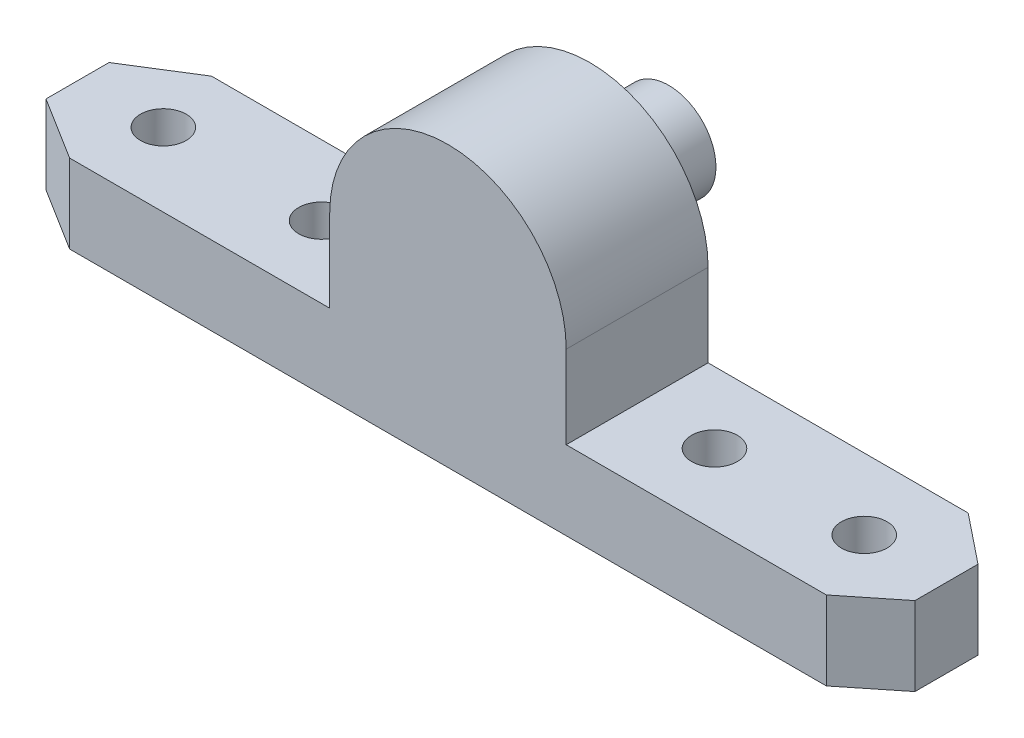
ISO-10303-21;
HEADER;
FILE_DESCRIPTION(('STEP AP214'),'2;1');
FILE_NAME('part.step','',(''),(''),'','','');
FILE_SCHEMA(('AUTOMOTIVE_DESIGN { 1 0 10303 214 1 1 1 1 }'));
ENDSEC;
DATA;
#1=APPLICATION_CONTEXT('core data for automotive mechanical design processes');
#2=APPLICATION_PROTOCOL_DEFINITION('international standard','automotive_design',2000,#1);
#3=PRODUCT_CONTEXT('',#1,'mechanical');
#4=PRODUCT('Part','Part','',(#3));
#5=PRODUCT_RELATED_PRODUCT_CATEGORY('part','',(#4));
#6=PRODUCT_DEFINITION_FORMATION('','',#4);
#7=PRODUCT_DEFINITION_CONTEXT('part definition',#1,'design');
#8=PRODUCT_DEFINITION('design','',#6,#7);
#9=PRODUCT_DEFINITION_SHAPE('','',#8);
#10=(LENGTH_UNIT() NAMED_UNIT(*) SI_UNIT(.MILLI.,.METRE.));
#11=(NAMED_UNIT(*) PLANE_ANGLE_UNIT() SI_UNIT($,.RADIAN.));
#12=(NAMED_UNIT(*) SI_UNIT($,.STERADIAN.) SOLID_ANGLE_UNIT());
#13=UNCERTAINTY_MEASURE_WITH_UNIT(LENGTH_MEASURE(1.E-05),#10,'distance_accuracy_value','');
#14=(GEOMETRIC_REPRESENTATION_CONTEXT(3) GLOBAL_UNCERTAINTY_ASSIGNED_CONTEXT((#13)) GLOBAL_UNIT_ASSIGNED_CONTEXT((#10,
#11,#12)) REPRESENTATION_CONTEXT('',''));
#15=CARTESIAN_POINT('',(0.,0.,0.));
#16=DIRECTION('',(0.,0.,1.));
#17=DIRECTION('',(1.,0.,0.));
#18=AXIS2_PLACEMENT_3D('',#15,#16,#17);
#19=CARTESIAN_POINT('',(0.,5.,0.));
#20=DIRECTION('',(0.,-1.,0.));
#21=DIRECTION('',(0.,0.,-1.));
#22=AXIS2_PLACEMENT_3D('',#19,#20,#21);
#23=PLANE('',#22);
#24=CARTESIAN_POINT('',(-22.7160462296342,5.,-0.159099942734997));
#25=DIRECTION('',(0.,1.,0.));
#26=DIRECTION('',(0.,0.,1.));
#27=AXIS2_PLACEMENT_3D('',#24,#25,#26);
#28=CIRCLE('',#27,1.45);
#29=CARTESIAN_POINT('',(-22.7160462296342,5.,1.290900057265));
#30=VERTEX_POINT('',#29);
#31=EDGE_CURVE('E283',#30,#30,#28,.T.);
#32=ORIENTED_EDGE('',*,*,#31,.F.);
#33=EDGE_LOOP('',(#32));
#34=FACE_BOUND('',#33,.T.);
#35=CARTESIAN_POINT('',(-12.5720154098781,5.,-0.0530333142449984));
#36=DIRECTION('',(0.,1.,0.));
#37=DIRECTION('',(0.,0.,1.));
#38=AXIS2_PLACEMENT_3D('',#35,#36,#37);
#39=CIRCLE('',#38,1.45);
#40=CARTESIAN_POINT('',(-12.5720154098781,5.,1.396966685755));
#41=VERTEX_POINT('',#40);
#42=EDGE_CURVE('E287',#41,#41,#39,.T.);
#43=ORIENTED_EDGE('',*,*,#42,.F.);
#44=EDGE_LOOP('',(#43));
#45=FACE_BOUND('',#44,.T.);
#46=DIRECTION('',(0.,0.,1.));
#47=VECTOR('',#46,1.);
#48=CARTESIAN_POINT('',(-7.49999999999999,5.,-4.5));
#49=LINE('',#48,#47);
#50=CARTESIAN_POINT('',(-7.49999999999999,5.,-4.5));
#51=VERTEX_POINT('',#50);
#52=CARTESIAN_POINT('',(-7.49999999999999,5.,4.5));
#53=VERTEX_POINT('',#52);
#54=EDGE_CURVE('E241',#51,#53,#49,.T.);
#55=ORIENTED_EDGE('',*,*,#54,.F.);
#56=DIRECTION('',(-1.,0.,0.));
#57=VECTOR('',#56,1.);
#58=CARTESIAN_POINT('',(-24.,5.,-4.5));
#59=LINE('',#58,#57);
#60=CARTESIAN_POINT('',(-24.,5.,-4.5));
#61=VERTEX_POINT('',#60);
#62=EDGE_CURVE('E114',#51,#61,#59,.T.);
#63=ORIENTED_EDGE('',*,*,#62,.T.);
#64=DIRECTION('',(-0.847998304005088,0.,0.52999894000318));
#65=VECTOR('',#64,1.);
#66=CARTESIAN_POINT('',(-24.,5.,-4.5));
#67=LINE('',#66,#65);
#68=CARTESIAN_POINT('',(-28.,5.,-1.99999999999999));
#69=VERTEX_POINT('',#68);
#70=EDGE_CURVE('E255',#61,#69,#67,.T.);
#71=ORIENTED_EDGE('',*,*,#70,.T.);
#72=DIRECTION('',(0.,0.,1.));
#73=VECTOR('',#72,1.);
#74=CARTESIAN_POINT('',(-28.,5.,-1.99999999999999));
#75=LINE('',#74,#73);
#76=CARTESIAN_POINT('',(-28.,5.,2.));
#77=VERTEX_POINT('',#76);
#78=EDGE_CURVE('E258',#69,#77,#75,.T.);
#79=ORIENTED_EDGE('',*,*,#78,.T.);
#80=DIRECTION('',(0.847998304005088,0.,0.529998940003179));
#81=VECTOR('',#80,1.);
#82=CARTESIAN_POINT('',(-28.,5.,2.));
#83=LINE('',#82,#81);
#84=CARTESIAN_POINT('',(-24.,5.,4.5));
#85=VERTEX_POINT('',#84);
#86=EDGE_CURVE('E261',#77,#85,#83,.T.);
#87=ORIENTED_EDGE('',*,*,#86,.T.);
#88=DIRECTION('',(1.,0.,0.));
#89=VECTOR('',#88,1.);
#90=CARTESIAN_POINT('',(-24.,5.,4.5));
#91=LINE('',#90,#89);
#92=EDGE_CURVE('E143',#85,#53,#91,.T.);
#93=ORIENTED_EDGE('',*,*,#92,.T.);
#94=EDGE_LOOP('',(#55,#63,#71,#79,#87,#93));
#95=FACE_BOUND('',#94,.T.);
#96=ADVANCED_FACE('F45',(#34,#45,#95),#23,.F.);
#97=CARTESIAN_POINT('',(-24.,5.,-4.5));
#98=DIRECTION('',(0.,0.,1.));
#99=DIRECTION('',(1.,0.,0.));
#100=AXIS2_PLACEMENT_3D('',#97,#98,#99);
#101=PLANE('',#100);
#102=CARTESIAN_POINT('',(0.,11.,-4.5));
#103=DIRECTION('',(0.,0.,1.));
#104=DIRECTION('',(1.,0.,0.));
#105=AXIS2_PLACEMENT_3D('',#102,#103,#104);
#106=CIRCLE('',#105,3.);
#107=CARTESIAN_POINT('',(3.,11.,-4.5));
#108=VERTEX_POINT('',#107);
#109=EDGE_CURVE('E288',#108,#108,#106,.T.);
#110=ORIENTED_EDGE('',*,*,#109,.T.);
#111=EDGE_LOOP('',(#110));
#112=FACE_BOUND('',#111,.T.);
#113=DIRECTION('',(-1.,0.,0.));
#114=VECTOR('',#113,1.);
#115=CARTESIAN_POINT('',(-24.,0.,-4.5));
#116=LINE('',#115,#114);
#117=CARTESIAN_POINT('',(24.,0.,-4.5));
#118=VERTEX_POINT('',#117);
#119=CARTESIAN_POINT('',(-24.,0.,-4.5));
#120=VERTEX_POINT('',#119);
#121=EDGE_CURVE('E164',#118,#120,#116,.T.);
#122=ORIENTED_EDGE('',*,*,#121,.T.);
#123=DIRECTION('',(0.,-1.,0.));
#124=VECTOR('',#123,1.);
#125=CARTESIAN_POINT('',(-24.,5.,-4.5));
#126=LINE('',#125,#124);
#127=EDGE_CURVE('E11',#61,#120,#126,.T.);
#128=ORIENTED_EDGE('',*,*,#127,.F.);
#129=ORIENTED_EDGE('',*,*,#62,.F.);
#130=DIRECTION('',(0.,-1.,0.));
#131=VECTOR('',#130,1.);
#132=CARTESIAN_POINT('',(-7.49999999999999,5.,-4.5));
#133=LINE('',#132,#131);
#134=CARTESIAN_POINT('',(-7.49999999999999,10.25,-4.5));
#135=VERTEX_POINT('',#134);
#136=EDGE_CURVE('E232',#135,#51,#133,.T.);
#137=ORIENTED_EDGE('',*,*,#136,.F.);
#138=CARTESIAN_POINT('',(0.,10.25,-4.5));
#139=DIRECTION('',(0.,0.,1.));
#140=DIRECTION('',(-1.,0.,0.));
#141=AXIS2_PLACEMENT_3D('',#138,#139,#140);
#142=CIRCLE('',#141,7.5);
#143=CARTESIAN_POINT('',(7.50000000000001,10.25,-4.5));
#144=VERTEX_POINT('',#143);
#145=EDGE_CURVE('E271',#144,#135,#142,.T.);
#146=ORIENTED_EDGE('',*,*,#145,.F.);
#147=DIRECTION('',(0.,1.,0.));
#148=VECTOR('',#147,1.);
#149=CARTESIAN_POINT('',(7.50000000000001,10.25,-4.5));
#150=LINE('',#149,#148);
#151=CARTESIAN_POINT('',(7.50000000000001,5.,-4.5));
#152=VERTEX_POINT('',#151);
#153=EDGE_CURVE('E238',#152,#144,#150,.T.);
#154=ORIENTED_EDGE('',*,*,#153,.F.);
#155=CARTESIAN_POINT('',(24.,5.,-4.5));
#156=VERTEX_POINT('',#155);
#157=EDGE_CURVE('E252',#156,#152,#59,.T.);
#158=ORIENTED_EDGE('',*,*,#157,.F.);
#159=DIRECTION('',(0.,-1.,0.));
#160=VECTOR('',#159,1.);
#161=CARTESIAN_POINT('',(24.,5.,-4.5));
#162=LINE('',#161,#160);
#163=EDGE_CURVE('E160',#156,#118,#162,.T.);
#164=ORIENTED_EDGE('',*,*,#163,.T.);
#165=EDGE_LOOP('',(#122,#128,#129,#137,#146,#154,#158,#164));
#166=FACE_BOUND('',#165,.T.);
#167=ADVANCED_FACE('F47',(#112,#166),#101,.F.);
#168=CARTESIAN_POINT('',(-24.,5.,-4.5));
#169=DIRECTION('',(0.52999894000318,0.,0.847998304005088));
#170=DIRECTION('',(0.847998304005088,0.,-0.52999894000318));
#171=AXIS2_PLACEMENT_3D('',#168,#169,#170);
#172=PLANE('',#171);
#173=DIRECTION('',(-0.847998304005088,0.,0.52999894000318));
#174=VECTOR('',#173,1.);
#175=CARTESIAN_POINT('',(-24.,0.,-4.5));
#176=LINE('',#175,#174);
#177=CARTESIAN_POINT('',(-28.,0.,-1.99999999999999));
#178=VERTEX_POINT('',#177);
#179=EDGE_CURVE('E168',#120,#178,#176,.T.);
#180=ORIENTED_EDGE('',*,*,#179,.T.);
#181=DIRECTION('',(0.,-1.,0.));
#182=VECTOR('',#181,1.);
#183=CARTESIAN_POINT('',(-28.,5.,-1.99999999999999));
#184=LINE('',#183,#182);
#185=EDGE_CURVE('E55',#69,#178,#184,.T.);
#186=ORIENTED_EDGE('',*,*,#185,.F.);
#187=ORIENTED_EDGE('',*,*,#70,.F.);
#188=ORIENTED_EDGE('',*,*,#127,.T.);
#189=EDGE_LOOP('',(#180,#186,#187,#188));
#190=FACE_BOUND('',#189,.T.);
#191=ADVANCED_FACE('F322',(#190),#172,.F.);
#192=CARTESIAN_POINT('',(-28.,5.,-1.99999999999999));
#193=DIRECTION('',(1.,0.,0.));
#194=DIRECTION('',(0.,0.,-1.));
#195=AXIS2_PLACEMENT_3D('',#192,#193,#194);
#196=PLANE('',#195);
#197=DIRECTION('',(0.,0.,1.));
#198=VECTOR('',#197,1.);
#199=CARTESIAN_POINT('',(-28.,0.,-1.99999999999999));
#200=LINE('',#199,#198);
#201=CARTESIAN_POINT('',(-28.,0.,2.));
#202=VERTEX_POINT('',#201);
#203=EDGE_CURVE('E172',#178,#202,#200,.T.);
#204=ORIENTED_EDGE('',*,*,#203,.T.);
#205=DIRECTION('',(0.,-1.,0.));
#206=VECTOR('',#205,1.);
#207=CARTESIAN_POINT('',(-28.,5.,2.));
#208=LINE('',#207,#206);
#209=EDGE_CURVE('E198',#77,#202,#208,.T.);
#210=ORIENTED_EDGE('',*,*,#209,.F.);
#211=ORIENTED_EDGE('',*,*,#78,.F.);
#212=ORIENTED_EDGE('',*,*,#185,.T.);
#213=EDGE_LOOP('',(#204,#210,#211,#212));
#214=FACE_BOUND('',#213,.T.);
#215=ADVANCED_FACE('F477',(#214),#196,.F.);
#216=CARTESIAN_POINT('',(-28.,5.,2.));
#217=DIRECTION('',(0.529998940003179,0.,-0.847998304005088));
#218=DIRECTION('',(-0.847998304005088,0.,-0.529998940003179));
#219=AXIS2_PLACEMENT_3D('',#216,#217,#218);
#220=PLANE('',#219);
#221=DIRECTION('',(0.847998304005088,0.,0.529998940003179));
#222=VECTOR('',#221,1.);
#223=CARTESIAN_POINT('',(-28.,0.,2.));
#224=LINE('',#223,#222);
#225=CARTESIAN_POINT('',(-24.,0.,4.5));
#226=VERTEX_POINT('',#225);
#227=EDGE_CURVE('E175',#202,#226,#224,.T.);
#228=ORIENTED_EDGE('',*,*,#227,.T.);
#229=DIRECTION('',(0.,-1.,0.));
#230=VECTOR('',#229,1.);
#231=CARTESIAN_POINT('',(-24.,5.,4.5));
#232=LINE('',#231,#230);
#233=EDGE_CURVE('E194',#85,#226,#232,.T.);
#234=ORIENTED_EDGE('',*,*,#233,.F.);
#235=ORIENTED_EDGE('',*,*,#86,.F.);
#236=ORIENTED_EDGE('',*,*,#209,.T.);
#237=EDGE_LOOP('',(#228,#234,#235,#236));
#238=FACE_BOUND('',#237,.T.);
#239=ADVANCED_FACE('F420',(#238),#220,.F.);
#240=CARTESIAN_POINT('',(-24.,5.,4.5));
#241=DIRECTION('',(0.,0.,-1.));
#242=DIRECTION('',(-1.,0.,0.));
#243=AXIS2_PLACEMENT_3D('',#240,#241,#242);
#244=PLANE('',#243);
#245=DIRECTION('',(1.,0.,0.));
#246=VECTOR('',#245,1.);
#247=CARTESIAN_POINT('',(-24.,0.,4.5));
#248=LINE('',#247,#246);
#249=CARTESIAN_POINT('',(24.,0.,4.5));
#250=VERTEX_POINT('',#249);
#251=EDGE_CURVE('E178',#226,#250,#248,.T.);
#252=ORIENTED_EDGE('',*,*,#251,.T.);
#253=DIRECTION('',(0.,-1.,0.));
#254=VECTOR('',#253,1.);
#255=CARTESIAN_POINT('',(24.,5.,4.5));
#256=LINE('',#255,#254);
#257=CARTESIAN_POINT('',(24.,5.,4.5));
#258=VERTEX_POINT('',#257);
#259=EDGE_CURVE('E153',#258,#250,#256,.T.);
#260=ORIENTED_EDGE('',*,*,#259,.F.);
#261=CARTESIAN_POINT('',(7.50000000000001,5.,4.5));
#262=VERTEX_POINT('',#261);
#263=EDGE_CURVE('E138',#262,#258,#91,.T.);
#264=ORIENTED_EDGE('',*,*,#263,.F.);
#265=DIRECTION('',(0.,1.,0.));
#266=VECTOR('',#265,1.);
#267=CARTESIAN_POINT('',(7.50000000000001,10.25,4.5));
#268=LINE('',#267,#266);
#269=CARTESIAN_POINT('',(7.50000000000001,10.25,4.5));
#270=VERTEX_POINT('',#269);
#271=EDGE_CURVE('E63',#262,#270,#268,.T.);
#272=ORIENTED_EDGE('',*,*,#271,.T.);
#273=CARTESIAN_POINT('',(0.,10.25,4.5));
#274=DIRECTION('',(0.,0.,1.));
#275=DIRECTION('',(-1.,0.,0.));
#276=AXIS2_PLACEMENT_3D('',#273,#274,#275);
#277=CIRCLE('',#276,7.5);
#278=CARTESIAN_POINT('',(-7.49999999999999,10.25,4.5));
#279=VERTEX_POINT('',#278);
#280=EDGE_CURVE('E223',#270,#279,#277,.T.);
#281=ORIENTED_EDGE('',*,*,#280,.T.);
#282=DIRECTION('',(0.,-1.,0.));
#283=VECTOR('',#282,1.);
#284=CARTESIAN_POINT('',(-7.49999999999999,5.,4.5));
#285=LINE('',#284,#283);
#286=EDGE_CURVE('E229',#279,#53,#285,.T.);
#287=ORIENTED_EDGE('',*,*,#286,.T.);
#288=ORIENTED_EDGE('',*,*,#92,.F.);
#289=ORIENTED_EDGE('',*,*,#233,.T.);
#290=EDGE_LOOP('',(#252,#260,#264,#272,#281,#287,#288,#289));
#291=FACE_BOUND('',#290,.T.);
#292=ADVANCED_FACE('F418',(#291),#244,.F.);
#293=CARTESIAN_POINT('',(27.1224989991992,5.,2.));
#294=DIRECTION('',(-0.625,0.,-0.7806247497998));
#295=DIRECTION('',(-0.7806247497998,0.,0.625));
#296=AXIS2_PLACEMENT_3D('',#293,#294,#295);
#297=PLANE('',#296);
#298=DIRECTION('',(0.7806247497998,0.,-0.625));
#299=VECTOR('',#298,1.);
#300=CARTESIAN_POINT('',(27.1224989991992,0.,2.));
#301=LINE('',#300,#299);
#302=CARTESIAN_POINT('',(27.1224989991992,0.,2.));
#303=VERTEX_POINT('',#302);
#304=EDGE_CURVE('E149',#250,#303,#301,.T.);
#305=ORIENTED_EDGE('',*,*,#304,.T.);
#306=DIRECTION('',(0.,-1.,0.));
#307=VECTOR('',#306,1.);
#308=CARTESIAN_POINT('',(27.1224989991992,5.,2.));
#309=LINE('',#308,#307);
#310=CARTESIAN_POINT('',(27.1224989991992,5.,2.));
#311=VERTEX_POINT('',#310);
#312=EDGE_CURVE('E146',#311,#303,#309,.T.);
#313=ORIENTED_EDGE('',*,*,#312,.F.);
#314=DIRECTION('',(0.7806247497998,0.,-0.625));
#315=VECTOR('',#314,1.);
#316=CARTESIAN_POINT('',(27.1224989991992,5.,2.));
#317=LINE('',#316,#315);
#318=EDGE_CURVE('E131',#258,#311,#317,.T.);
#319=ORIENTED_EDGE('',*,*,#318,.F.);
#320=ORIENTED_EDGE('',*,*,#259,.T.);
#321=EDGE_LOOP('',(#305,#313,#319,#320));
#322=FACE_BOUND('',#321,.T.);
#323=ADVANCED_FACE('F147',(#322),#297,.F.);
#324=CARTESIAN_POINT('',(27.1224989991992,5.,-2.));
#325=DIRECTION('',(-1.,0.,0.));
#326=DIRECTION('',(0.,0.,1.));
#327=AXIS2_PLACEMENT_3D('',#324,#325,#326);
#328=PLANE('',#327);
#329=DIRECTION('',(0.,0.,-1.));
#330=VECTOR('',#329,1.);
#331=CARTESIAN_POINT('',(27.1224989991992,0.,-2.));
#332=LINE('',#331,#330);
#333=CARTESIAN_POINT('',(27.1224989991992,0.,-2.));
#334=VERTEX_POINT('',#333);
#335=EDGE_CURVE('E183',#303,#334,#332,.T.);
#336=ORIENTED_EDGE('',*,*,#335,.T.);
#337=DIRECTION('',(0.,-1.,0.));
#338=VECTOR('',#337,1.);
#339=CARTESIAN_POINT('',(27.1224989991992,5.,-2.));
#340=LINE('',#339,#338);
#341=CARTESIAN_POINT('',(27.1224989991992,5.,-2.));
#342=VERTEX_POINT('',#341);
#343=EDGE_CURVE('E154',#342,#334,#340,.T.);
#344=ORIENTED_EDGE('',*,*,#343,.F.);
#345=DIRECTION('',(0.,0.,-1.));
#346=VECTOR('',#345,1.);
#347=CARTESIAN_POINT('',(27.1224989991992,5.,-2.));
#348=LINE('',#347,#346);
#349=EDGE_CURVE('E135',#311,#342,#348,.T.);
#350=ORIENTED_EDGE('',*,*,#349,.F.);
#351=ORIENTED_EDGE('',*,*,#312,.T.);
#352=EDGE_LOOP('',(#336,#344,#350,#351));
#353=FACE_BOUND('',#352,.T.);
#354=ADVANCED_FACE('F156',(#353),#328,.F.);
#355=CARTESIAN_POINT('',(24.,5.,-4.5));
#356=DIRECTION('',(-0.625,0.,0.7806247497998));
#357=DIRECTION('',(0.7806247497998,0.,0.625));
#358=AXIS2_PLACEMENT_3D('',#355,#356,#357);
#359=PLANE('',#358);
#360=DIRECTION('',(-0.7806247497998,0.,-0.625));
#361=VECTOR('',#360,1.);
#362=CARTESIAN_POINT('',(24.,0.,-4.5));
#363=LINE('',#362,#361);
#364=EDGE_CURVE('E105',#334,#118,#363,.T.);
#365=ORIENTED_EDGE('',*,*,#364,.T.);
#366=ORIENTED_EDGE('',*,*,#163,.F.);
#367=DIRECTION('',(-0.7806247497998,0.,-0.625));
#368=VECTOR('',#367,1.);
#369=CARTESIAN_POINT('',(24.,5.,-4.5));
#370=LINE('',#369,#368);
#371=EDGE_CURVE('E72',#342,#156,#370,.T.);
#372=ORIENTED_EDGE('',*,*,#371,.F.);
#373=ORIENTED_EDGE('',*,*,#343,.T.);
#374=EDGE_LOOP('',(#365,#366,#372,#373));
#375=FACE_BOUND('',#374,.T.);
#376=ADVANCED_FACE('F329',(#375),#359,.F.);
#377=CARTESIAN_POINT('',(21.9056247497998,5.,0.));
#378=DIRECTION('',(0.,1.,0.));
#379=DIRECTION('',(0.,0.,1.));
#380=AXIS2_PLACEMENT_3D('',#377,#378,#379);
#381=CIRCLE('',#380,1.45);
#382=CARTESIAN_POINT('',(21.9056247497998,5.,1.45));
#383=VERTEX_POINT('',#382);
#384=EDGE_CURVE('E282',#383,#383,#381,.T.);
#385=ORIENTED_EDGE('',*,*,#384,.F.);
#386=EDGE_LOOP('',(#385));
#387=FACE_BOUND('',#386,.T.);
#388=CARTESIAN_POINT('',(12.4056247497998,5.,0.));
#389=DIRECTION('',(0.,1.,0.));
#390=DIRECTION('',(0.,0.,1.));
#391=AXIS2_PLACEMENT_3D('',#388,#389,#390);
#392=CIRCLE('',#391,1.45);
#393=CARTESIAN_POINT('',(12.4056247497998,5.,1.45));
#394=VERTEX_POINT('',#393);
#395=EDGE_CURVE('E210',#394,#394,#392,.T.);
#396=ORIENTED_EDGE('',*,*,#395,.F.);
#397=EDGE_LOOP('',(#396));
#398=FACE_BOUND('',#397,.T.);
#399=ORIENTED_EDGE('',*,*,#157,.T.);
#400=DIRECTION('',(0.,0.,1.));
#401=VECTOR('',#400,1.);
#402=CARTESIAN_POINT('',(7.50000000000001,5.,-4.5));
#403=LINE('',#402,#401);
#404=EDGE_CURVE('E169',#152,#262,#403,.T.);
#405=ORIENTED_EDGE('',*,*,#404,.T.);
#406=ORIENTED_EDGE('',*,*,#263,.T.);
#407=ORIENTED_EDGE('',*,*,#318,.T.);
#408=ORIENTED_EDGE('',*,*,#349,.T.);
#409=ORIENTED_EDGE('',*,*,#371,.T.);
#410=EDGE_LOOP('',(#399,#405,#406,#407,#408,#409));
#411=FACE_BOUND('',#410,.T.);
#412=ADVANCED_FACE('F133',(#387,#398,#411),#23,.F.);
#413=CARTESIAN_POINT('',(0.,0.,0.));
#414=DIRECTION('',(0.,-1.,0.));
#415=DIRECTION('',(0.,0.,-1.));
#416=AXIS2_PLACEMENT_3D('',#413,#414,#415);
#417=PLANE('',#416);
#418=CARTESIAN_POINT('',(-22.7160462296342,0.,-0.159099942734997));
#419=DIRECTION('',(0.,-1.,0.));
#420=DIRECTION('',(0.,0.,-1.));
#421=AXIS2_PLACEMENT_3D('',#418,#419,#420);
#422=CIRCLE('',#421,1.45);
#423=CARTESIAN_POINT('',(-22.7160462296342,0.,-1.609099942735));
#424=VERTEX_POINT('',#423);
#425=EDGE_CURVE('E49',#424,#424,#422,.T.);
#426=ORIENTED_EDGE('',*,*,#425,.F.);
#427=EDGE_LOOP('',(#426));
#428=FACE_BOUND('',#427,.T.);
#429=CARTESIAN_POINT('',(-12.5720154098781,0.,-0.0530333142449984));
#430=DIRECTION('',(0.,-1.,0.));
#431=DIRECTION('',(0.,0.,-1.));
#432=AXIS2_PLACEMENT_3D('',#429,#430,#431);
#433=CIRCLE('',#432,1.45);
#434=CARTESIAN_POINT('',(-12.5720154098781,0.,-1.503033314245));
#435=VERTEX_POINT('',#434);
#436=EDGE_CURVE('E213',#435,#435,#433,.T.);
#437=ORIENTED_EDGE('',*,*,#436,.F.);
#438=EDGE_LOOP('',(#437));
#439=FACE_BOUND('',#438,.T.);
#440=CARTESIAN_POINT('',(21.9056247497998,0.,0.));
#441=DIRECTION('',(0.,-1.,0.));
#442=DIRECTION('',(0.,0.,-1.));
#443=AXIS2_PLACEMENT_3D('',#440,#441,#442);
#444=CIRCLE('',#443,1.45);
#445=CARTESIAN_POINT('',(21.9056247497998,0.,-1.45));
#446=VERTEX_POINT('',#445);
#447=EDGE_CURVE('E209',#446,#446,#444,.T.);
#448=ORIENTED_EDGE('',*,*,#447,.F.);
#449=EDGE_LOOP('',(#448));
#450=FACE_BOUND('',#449,.T.);
#451=CARTESIAN_POINT('',(12.4056247497998,0.,0.));
#452=DIRECTION('',(0.,-1.,0.));
#453=DIRECTION('',(0.,0.,-1.));
#454=AXIS2_PLACEMENT_3D('',#451,#452,#453);
#455=CIRCLE('',#454,1.45);
#456=CARTESIAN_POINT('',(12.4056247497998,0.,-1.45));
#457=VERTEX_POINT('',#456);
#458=EDGE_CURVE('E205',#457,#457,#455,.T.);
#459=ORIENTED_EDGE('',*,*,#458,.F.);
#460=EDGE_LOOP('',(#459));
#461=FACE_BOUND('',#460,.T.);
#462=ORIENTED_EDGE('',*,*,#121,.F.);
#463=ORIENTED_EDGE('',*,*,#364,.F.);
#464=ORIENTED_EDGE('',*,*,#335,.F.);
#465=ORIENTED_EDGE('',*,*,#304,.F.);
#466=ORIENTED_EDGE('',*,*,#251,.F.);
#467=ORIENTED_EDGE('',*,*,#227,.F.);
#468=ORIENTED_EDGE('',*,*,#203,.F.);
#469=ORIENTED_EDGE('',*,*,#179,.F.);
#470=EDGE_LOOP('',(#462,#463,#464,#465,#466,#467,#468,#469));
#471=FACE_BOUND('',#470,.T.);
#472=ADVANCED_FACE('F328',(#428,#439,#450,#461,#471),#417,.T.);
#473=CARTESIAN_POINT('',(7.50000000000001,10.25,-4.5));
#474=DIRECTION('',(1.,0.,0.));
#475=DIRECTION('',(0.,1.,0.));
#476=AXIS2_PLACEMENT_3D('',#473,#474,#475);
#477=PLANE('',#476);
#478=ORIENTED_EDGE('',*,*,#271,.F.);
#479=ORIENTED_EDGE('',*,*,#404,.F.);
#480=ORIENTED_EDGE('',*,*,#153,.T.);
#481=DIRECTION('',(0.,0.,1.));
#482=VECTOR('',#481,1.);
#483=CARTESIAN_POINT('',(7.50000000000001,10.25,-4.5));
#484=LINE('',#483,#482);
#485=EDGE_CURVE('E249',#144,#270,#484,.T.);
#486=ORIENTED_EDGE('',*,*,#485,.T.);
#487=EDGE_LOOP('',(#478,#479,#480,#486));
#488=FACE_BOUND('',#487,.T.);
#489=ADVANCED_FACE('F334',(#488),#477,.T.);
#490=CARTESIAN_POINT('',(-7.49999999999999,5.,-4.5));
#491=DIRECTION('',(-1.,0.,0.));
#492=DIRECTION('',(0.,0.,1.));
#493=AXIS2_PLACEMENT_3D('',#490,#491,#492);
#494=PLANE('',#493);
#495=ORIENTED_EDGE('',*,*,#286,.F.);
#496=DIRECTION('',(0.,0.,1.));
#497=VECTOR('',#496,1.);
#498=CARTESIAN_POINT('',(-7.49999999999999,10.25,-4.5));
#499=LINE('',#498,#497);
#500=EDGE_CURVE('E245',#135,#279,#499,.T.);
#501=ORIENTED_EDGE('',*,*,#500,.F.);
#502=ORIENTED_EDGE('',*,*,#136,.T.);
#503=ORIENTED_EDGE('',*,*,#54,.T.);
#504=EDGE_LOOP('',(#495,#501,#502,#503));
#505=FACE_BOUND('',#504,.T.);
#506=ADVANCED_FACE('F354',(#505),#494,.T.);
#507=CARTESIAN_POINT('',(0.,10.25,-4.5));
#508=DIRECTION('',(0.,0.,1.));
#509=DIRECTION('',(1.,0.,0.));
#510=AXIS2_PLACEMENT_3D('',#507,#508,#509);
#511=CYLINDRICAL_SURFACE('',#510,7.5);
#512=ORIENTED_EDGE('',*,*,#280,.F.);
#513=ORIENTED_EDGE('',*,*,#485,.F.);
#514=ORIENTED_EDGE('',*,*,#145,.T.);
#515=ORIENTED_EDGE('',*,*,#500,.T.);
#516=EDGE_LOOP('',(#512,#513,#514,#515));
#517=FACE_BOUND('',#516,.T.);
#518=ADVANCED_FACE('F345',(#517),#511,.T.);
#519=CARTESIAN_POINT('',(12.4056247497998,-1.,0.));
#520=DIRECTION('',(0.,1.,0.));
#521=DIRECTION('',(0.,0.,1.));
#522=AXIS2_PLACEMENT_3D('',#519,#520,#521);
#523=CYLINDRICAL_SURFACE('',#522,1.45);
#524=ORIENTED_EDGE('',*,*,#458,.T.);
#525=EDGE_LOOP('',(#524));
#526=FACE_BOUND('',#525,.T.);
#527=ORIENTED_EDGE('',*,*,#395,.T.);
#528=EDGE_LOOP('',(#527));
#529=FACE_BOUND('',#528,.T.);
#530=ADVANCED_FACE('F342',(#526,#529),#523,.F.);
#531=CARTESIAN_POINT('',(21.9056247497998,-1.,0.));
#532=DIRECTION('',(0.,1.,0.));
#533=DIRECTION('',(0.,0.,1.));
#534=AXIS2_PLACEMENT_3D('',#531,#532,#533);
#535=CYLINDRICAL_SURFACE('',#534,1.45);
#536=ORIENTED_EDGE('',*,*,#447,.T.);
#537=EDGE_LOOP('',(#536));
#538=FACE_BOUND('',#537,.T.);
#539=ORIENTED_EDGE('',*,*,#384,.T.);
#540=EDGE_LOOP('',(#539));
#541=FACE_BOUND('',#540,.T.);
#542=ADVANCED_FACE('F344',(#538,#541),#535,.F.);
#543=CARTESIAN_POINT('',(-12.5720154098781,-1.,-0.0530333142449984));
#544=DIRECTION('',(0.,1.,0.));
#545=DIRECTION('',(0.,0.,1.));
#546=AXIS2_PLACEMENT_3D('',#543,#544,#545);
#547=CYLINDRICAL_SURFACE('',#546,1.45);
#548=ORIENTED_EDGE('',*,*,#436,.T.);
#549=EDGE_LOOP('',(#548));
#550=FACE_BOUND('',#549,.T.);
#551=ORIENTED_EDGE('',*,*,#42,.T.);
#552=EDGE_LOOP('',(#551));
#553=FACE_BOUND('',#552,.T.);
#554=ADVANCED_FACE('F351',(#550,#553),#547,.F.);
#555=CARTESIAN_POINT('',(-22.7160462296342,-1.,-0.159099942734997));
#556=DIRECTION('',(0.,1.,0.));
#557=DIRECTION('',(0.,0.,1.));
#558=AXIS2_PLACEMENT_3D('',#555,#556,#557);
#559=CYLINDRICAL_SURFACE('',#558,1.45);
#560=ORIENTED_EDGE('',*,*,#425,.T.);
#561=EDGE_LOOP('',(#560));
#562=FACE_BOUND('',#561,.T.);
#563=ORIENTED_EDGE('',*,*,#31,.T.);
#564=EDGE_LOOP('',(#563));
#565=FACE_BOUND('',#564,.T.);
#566=ADVANCED_FACE('F312',(#562,#565),#559,.F.);
#567=CARTESIAN_POINT('',(0.,11.,-9.5));
#568=DIRECTION('',(0.,0.,1.));
#569=DIRECTION('',(1.,0.,0.));
#570=AXIS2_PLACEMENT_3D('',#567,#568,#569);
#571=CYLINDRICAL_SURFACE('',#570,3.);
#572=CARTESIAN_POINT('',(0.,11.,-9.5));
#573=DIRECTION('',(0.,0.,1.));
#574=DIRECTION('',(1.,0.,0.));
#575=AXIS2_PLACEMENT_3D('',#572,#573,#574);
#576=CIRCLE('',#575,3.);
#577=CARTESIAN_POINT('',(3.,11.,-9.5));
#578=VERTEX_POINT('',#577);
#579=EDGE_CURVE('E298',#578,#578,#576,.T.);
#580=ORIENTED_EDGE('',*,*,#579,.T.);
#581=EDGE_LOOP('',(#580));
#582=FACE_BOUND('',#581,.T.);
#583=ORIENTED_EDGE('',*,*,#109,.F.);
#584=EDGE_LOOP('',(#583));
#585=FACE_BOUND('',#584,.T.);
#586=ADVANCED_FACE('F303',(#582,#585),#571,.T.);
#587=CARTESIAN_POINT('',(0.,11.,-9.5));
#588=DIRECTION('',(0.,0.,1.));
#589=DIRECTION('',(1.,0.,0.));
#590=AXIS2_PLACEMENT_3D('',#587,#588,#589);
#591=PLANE('',#590);
#592=ORIENTED_EDGE('',*,*,#579,.F.);
#593=EDGE_LOOP('',(#592));
#594=FACE_BOUND('',#593,.T.);
#595=ADVANCED_FACE('F306',(#594),#591,.F.);
#596=CLOSED_SHELL('',(#96,#167,#191,#215,#239,#292,#323,#354,#376,#412,#472,#489,#506,#518,#530,
#542,#554,#566,#586,#595));
#597=MANIFOLD_SOLID_BREP('B2',#596);
#598=ADVANCED_BREP_SHAPE_REPRESENTATION('',(#18,#597),#14);
#599=SHAPE_DEFINITION_REPRESENTATION(#9,#598);
ENDSEC;
END-ISO-10303-21;
